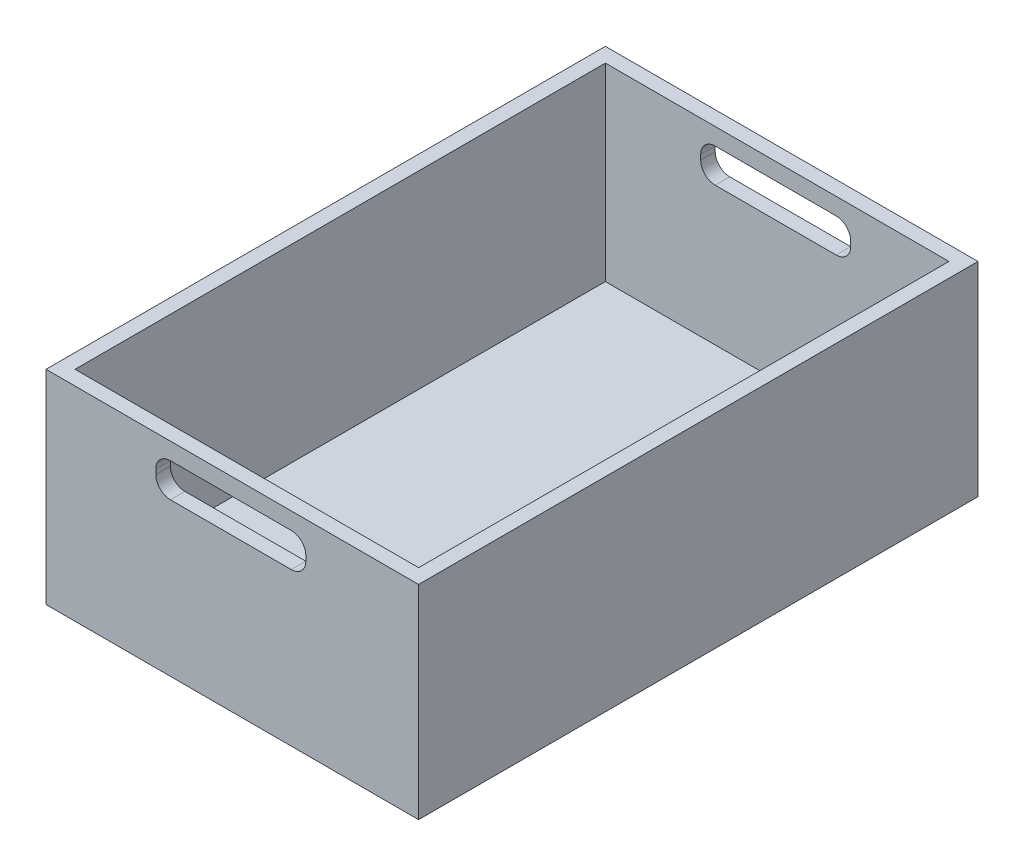
ISO-10303-21;
HEADER;
FILE_DESCRIPTION(('STEP AP214'),'2;1');
FILE_NAME('part.step','',(''),(''),'','','');
FILE_SCHEMA(('AUTOMOTIVE_DESIGN { 1 0 10303 214 1 1 1 1 }'));
ENDSEC;
DATA;
#1=APPLICATION_CONTEXT('core data for automotive mechanical design processes');
#2=APPLICATION_PROTOCOL_DEFINITION('international standard','automotive_design',2000,#1);
#3=PRODUCT_CONTEXT('',#1,'mechanical');
#4=PRODUCT('Part','Part','',(#3));
#5=PRODUCT_RELATED_PRODUCT_CATEGORY('part','',(#4));
#6=PRODUCT_DEFINITION_FORMATION('','',#4);
#7=PRODUCT_DEFINITION_CONTEXT('part definition',#1,'design');
#8=PRODUCT_DEFINITION('design','',#6,#7);
#9=PRODUCT_DEFINITION_SHAPE('','',#8);
#10=(LENGTH_UNIT() NAMED_UNIT(*) SI_UNIT(.MILLI.,.METRE.));
#11=(NAMED_UNIT(*) PLANE_ANGLE_UNIT() SI_UNIT($,.RADIAN.));
#12=(NAMED_UNIT(*) SI_UNIT($,.STERADIAN.) SOLID_ANGLE_UNIT());
#13=UNCERTAINTY_MEASURE_WITH_UNIT(LENGTH_MEASURE(1.E-05),#10,'distance_accuracy_value','');
#14=(GEOMETRIC_REPRESENTATION_CONTEXT(3) GLOBAL_UNCERTAINTY_ASSIGNED_CONTEXT((#13)) GLOBAL_UNIT_ASSIGNED_CONTEXT((#10,
#11,#12)) REPRESENTATION_CONTEXT('',''));
#15=CARTESIAN_POINT('',(0.,0.,0.));
#16=DIRECTION('',(0.,0.,1.));
#17=DIRECTION('',(1.,0.,0.));
#18=AXIS2_PLACEMENT_3D('',#15,#16,#17);
#19=CARTESIAN_POINT('',(0.,15.,0.));
#20=DIRECTION('',(0.,-1.,0.));
#21=DIRECTION('',(0.,0.,-1.));
#22=AXIS2_PLACEMENT_3D('',#19,#20,#21);
#23=PLANE('',#22);
#24=DIRECTION('',(0.,0.,1.));
#25=VECTOR('',#24,1.);
#26=CARTESIAN_POINT('',(177.5,15.,289.));
#27=LINE('',#26,#25);
#28=CARTESIAN_POINT('',(177.5,15.,-274.));
#29=VERTEX_POINT('',#28);
#30=CARTESIAN_POINT('',(177.5,15.,274.));
#31=VERTEX_POINT('',#30);
#32=EDGE_CURVE('E243',#29,#31,#27,.T.);
#33=ORIENTED_EDGE('',*,*,#32,.F.);
#34=DIRECTION('',(-1.,0.,0.));
#35=VECTOR('',#34,1.);
#36=CARTESIAN_POINT('',(-177.5,15.,-274.));
#37=LINE('',#36,#35);
#38=CARTESIAN_POINT('',(-177.5,15.,-274.));
#39=VERTEX_POINT('',#38);
#40=EDGE_CURVE('E218',#29,#39,#37,.T.);
#41=ORIENTED_EDGE('',*,*,#40,.T.);
#42=DIRECTION('',(0.,0.,1.));
#43=VECTOR('',#42,1.);
#44=CARTESIAN_POINT('',(-177.5,15.,289.));
#45=LINE('',#44,#43);
#46=CARTESIAN_POINT('',(-177.5,15.,274.));
#47=VERTEX_POINT('',#46);
#48=EDGE_CURVE('E237',#39,#47,#45,.T.);
#49=ORIENTED_EDGE('',*,*,#48,.T.);
#50=DIRECTION('',(-1.,0.,0.));
#51=VECTOR('',#50,1.);
#52=CARTESIAN_POINT('',(-177.5,15.,274.));
#53=LINE('',#52,#51);
#54=EDGE_CURVE('E225',#31,#47,#53,.T.);
#55=ORIENTED_EDGE('',*,*,#54,.F.);
#56=EDGE_LOOP('',(#33,#41,#49,#55));
#57=FACE_BOUND('',#56,.T.);
#58=ADVANCED_FACE('F33',(#57),#23,.F.);
#59=CARTESIAN_POINT('',(177.5,210.5,289.));
#60=DIRECTION('',(1.,0.,0.));
#61=DIRECTION('',(0.,0.,-1.));
#62=AXIS2_PLACEMENT_3D('',#59,#60,#61);
#63=PLANE('',#62);
#64=DIRECTION('',(0.,0.,1.));
#65=VECTOR('',#64,1.);
#66=CARTESIAN_POINT('',(177.5,210.5,289.));
#67=LINE('',#66,#65);
#68=CARTESIAN_POINT('',(177.5,210.5,-274.));
#69=VERTEX_POINT('',#68);
#70=CARTESIAN_POINT('',(177.5,210.5,274.));
#71=VERTEX_POINT('',#70);
#72=EDGE_CURVE('E250',#69,#71,#67,.T.);
#73=ORIENTED_EDGE('',*,*,#72,.F.);
#74=DIRECTION('',(0.,-1.,0.));
#75=VECTOR('',#74,1.);
#76=CARTESIAN_POINT('',(177.5,210.5,-274.));
#77=LINE('',#76,#75);
#78=EDGE_CURVE('E217',#69,#29,#77,.T.);
#79=ORIENTED_EDGE('',*,*,#78,.T.);
#80=ORIENTED_EDGE('',*,*,#32,.T.);
#81=DIRECTION('',(0.,-1.,0.));
#82=VECTOR('',#81,1.);
#83=CARTESIAN_POINT('',(177.5,210.5,274.));
#84=LINE('',#83,#82);
#85=EDGE_CURVE('E234',#71,#31,#84,.T.);
#86=ORIENTED_EDGE('',*,*,#85,.F.);
#87=EDGE_LOOP('',(#73,#79,#80,#86));
#88=FACE_BOUND('',#87,.T.);
#89=ADVANCED_FACE('F436',(#88),#63,.F.);
#90=CARTESIAN_POINT('',(-177.5,210.5,289.));
#91=DIRECTION('',(1.,0.,0.));
#92=DIRECTION('',(0.,0.,-1.));
#93=AXIS2_PLACEMENT_3D('',#90,#91,#92);
#94=PLANE('',#93);
#95=DIRECTION('',(0.,-1.,0.));
#96=VECTOR('',#95,1.);
#97=CARTESIAN_POINT('',(-177.5,210.5,-274.));
#98=LINE('',#97,#96);
#99=CARTESIAN_POINT('',(-177.5,210.5,-274.));
#100=VERTEX_POINT('',#99);
#101=EDGE_CURVE('E223',#100,#39,#98,.T.);
#102=ORIENTED_EDGE('',*,*,#101,.F.);
#103=DIRECTION('',(0.,0.,1.));
#104=VECTOR('',#103,1.);
#105=CARTESIAN_POINT('',(-177.5,210.5,289.));
#106=LINE('',#105,#104);
#107=CARTESIAN_POINT('',(-177.5,210.5,274.));
#108=VERTEX_POINT('',#107);
#109=EDGE_CURVE('E241',#100,#108,#106,.T.);
#110=ORIENTED_EDGE('',*,*,#109,.T.);
#111=DIRECTION('',(0.,-1.,0.));
#112=VECTOR('',#111,1.);
#113=CARTESIAN_POINT('',(-177.5,210.5,274.));
#114=LINE('',#113,#112);
#115=EDGE_CURVE('E229',#108,#47,#114,.T.);
#116=ORIENTED_EDGE('',*,*,#115,.T.);
#117=ORIENTED_EDGE('',*,*,#48,.F.);
#118=EDGE_LOOP('',(#102,#110,#116,#117));
#119=FACE_BOUND('',#118,.T.);
#120=ADVANCED_FACE('F442',(#119),#94,.T.);
#121=CARTESIAN_POINT('',(192.5,15.,289.));
#122=DIRECTION('',(-1.,0.,0.));
#123=DIRECTION('',(0.,0.,1.));
#124=AXIS2_PLACEMENT_3D('',#121,#122,#123);
#125=PLANE('',#124);
#126=DIRECTION('',(0.,0.,-1.));
#127=VECTOR('',#126,1.);
#128=CARTESIAN_POINT('',(192.5,0.,289.));
#129=LINE('',#128,#127);
#130=CARTESIAN_POINT('',(192.5,0.,289.));
#131=VERTEX_POINT('',#130);
#132=CARTESIAN_POINT('',(192.5,0.,-289.));
#133=VERTEX_POINT('',#132);
#134=EDGE_CURVE('E255',#131,#133,#129,.T.);
#135=ORIENTED_EDGE('',*,*,#134,.T.);
#136=DIRECTION('',(0.,-1.,0.));
#137=VECTOR('',#136,1.);
#138=CARTESIAN_POINT('',(192.5,15.,-289.));
#139=LINE('',#138,#137);
#140=CARTESIAN_POINT('',(192.5,210.5,-289.));
#141=VERTEX_POINT('',#140);
#142=EDGE_CURVE('E274',#141,#133,#139,.T.);
#143=ORIENTED_EDGE('',*,*,#142,.F.);
#144=DIRECTION('',(0.,0.,-1.));
#145=VECTOR('',#144,1.);
#146=CARTESIAN_POINT('',(192.5,210.5,289.));
#147=LINE('',#146,#145);
#148=CARTESIAN_POINT('',(192.5,210.5,289.));
#149=VERTEX_POINT('',#148);
#150=EDGE_CURVE('E245',#149,#141,#147,.T.);
#151=ORIENTED_EDGE('',*,*,#150,.F.);
#152=DIRECTION('',(0.,-1.,0.));
#153=VECTOR('',#152,1.);
#154=CARTESIAN_POINT('',(192.5,15.,289.));
#155=LINE('',#154,#153);
#156=EDGE_CURVE('E265',#149,#131,#155,.T.);
#157=ORIENTED_EDGE('',*,*,#156,.T.);
#158=EDGE_LOOP('',(#135,#143,#151,#157));
#159=FACE_BOUND('',#158,.T.);
#160=ADVANCED_FACE('F35',(#159),#125,.F.);
#161=CARTESIAN_POINT('',(-192.5,15.,-289.));
#162=DIRECTION('',(0.,0.,1.));
#163=DIRECTION('',(1.,0.,0.));
#164=AXIS2_PLACEMENT_3D('',#161,#162,#163);
#165=PLANE('',#164);
#166=DIRECTION('',(0.,1.,0.));
#167=VECTOR('',#166,1.);
#168=CARTESIAN_POINT('',(75.9655531314844,178.,-289.));
#169=LINE('',#168,#167);
#170=CARTESIAN_POINT('',(75.9655531314844,173.,-289.));
#171=VERTEX_POINT('',#170);
#172=CARTESIAN_POINT('',(75.9655531314844,178.,-289.));
#173=VERTEX_POINT('',#172);
#174=EDGE_CURVE('E386',#171,#173,#169,.T.);
#175=ORIENTED_EDGE('',*,*,#174,.T.);
#176=CARTESIAN_POINT('',(60.9655531314844,178.,-289.));
#177=DIRECTION('',(0.,0.,1.));
#178=DIRECTION('',(-1.,0.,0.));
#179=AXIS2_PLACEMENT_3D('',#176,#177,#178);
#180=CIRCLE('',#179,15.);
#181=CARTESIAN_POINT('',(60.9655531314844,193.,-289.));
#182=VERTEX_POINT('',#181);
#183=EDGE_CURVE('E392',#173,#182,#180,.T.);
#184=ORIENTED_EDGE('',*,*,#183,.T.);
#185=DIRECTION('',(-1.,0.,0.));
#186=VECTOR('',#185,1.);
#187=CARTESIAN_POINT('',(-64.0344468685156,193.,-289.));
#188=LINE('',#187,#186);
#189=CARTESIAN_POINT('',(-64.0344468685156,193.,-289.));
#190=VERTEX_POINT('',#189);
#191=EDGE_CURVE('E379',#182,#190,#188,.T.);
#192=ORIENTED_EDGE('',*,*,#191,.T.);
#193=CARTESIAN_POINT('',(-64.0344468685156,178.,-289.));
#194=DIRECTION('',(0.,0.,1.));
#195=DIRECTION('',(1.,0.,0.));
#196=AXIS2_PLACEMENT_3D('',#193,#194,#195);
#197=CIRCLE('',#196,15.);
#198=CARTESIAN_POINT('',(-79.0344468685156,178.,-289.));
#199=VERTEX_POINT('',#198);
#200=EDGE_CURVE('E51',#190,#199,#197,.T.);
#201=ORIENTED_EDGE('',*,*,#200,.T.);
#202=DIRECTION('',(0.,-1.,0.));
#203=VECTOR('',#202,1.);
#204=CARTESIAN_POINT('',(-79.0344468685156,178.,-289.));
#205=LINE('',#204,#203);
#206=CARTESIAN_POINT('',(-79.0344468685156,173.,-289.));
#207=VERTEX_POINT('',#206);
#208=EDGE_CURVE('E373',#199,#207,#205,.T.);
#209=ORIENTED_EDGE('',*,*,#208,.T.);
#210=CARTESIAN_POINT('',(-64.0344468685156,173.,-289.));
#211=DIRECTION('',(0.,0.,1.));
#212=DIRECTION('',(1.,0.,0.));
#213=AXIS2_PLACEMENT_3D('',#210,#211,#212);
#214=CIRCLE('',#213,15.);
#215=CARTESIAN_POINT('',(-64.0344468685156,158.,-289.));
#216=VERTEX_POINT('',#215);
#217=EDGE_CURVE('E364',#207,#216,#214,.T.);
#218=ORIENTED_EDGE('',*,*,#217,.T.);
#219=DIRECTION('',(1.,0.,0.));
#220=VECTOR('',#219,1.);
#221=CARTESIAN_POINT('',(-64.0344468685156,158.,-289.));
#222=LINE('',#221,#220);
#223=CARTESIAN_POINT('',(60.9655531314844,158.,-289.));
#224=VERTEX_POINT('',#223);
#225=EDGE_CURVE('E372',#216,#224,#222,.T.);
#226=ORIENTED_EDGE('',*,*,#225,.T.);
#227=CARTESIAN_POINT('',(60.9655531314844,173.,-289.));
#228=DIRECTION('',(0.,0.,1.));
#229=DIRECTION('',(1.,0.,0.));
#230=AXIS2_PLACEMENT_3D('',#227,#228,#229);
#231=CIRCLE('',#230,15.);
#232=EDGE_CURVE('E384',#224,#171,#231,.T.);
#233=ORIENTED_EDGE('',*,*,#232,.T.);
#234=EDGE_LOOP('',(#175,#184,#192,#201,#209,#218,#226,#233));
#235=FACE_BOUND('',#234,.T.);
#236=DIRECTION('',(-1.,0.,0.));
#237=VECTOR('',#236,1.);
#238=CARTESIAN_POINT('',(-192.5,0.,-289.));
#239=LINE('',#238,#237);
#240=CARTESIAN_POINT('',(-192.5,0.,-289.));
#241=VERTEX_POINT('',#240);
#242=EDGE_CURVE('E259',#133,#241,#239,.T.);
#243=ORIENTED_EDGE('',*,*,#242,.T.);
#244=DIRECTION('',(0.,-1.,0.));
#245=VECTOR('',#244,1.);
#246=CARTESIAN_POINT('',(-192.5,15.,-289.));
#247=LINE('',#246,#245);
#248=CARTESIAN_POINT('',(-192.5,210.5,-289.));
#249=VERTEX_POINT('',#248);
#250=EDGE_CURVE('E271',#249,#241,#247,.T.);
#251=ORIENTED_EDGE('',*,*,#250,.F.);
#252=DIRECTION('',(-1.,0.,0.));
#253=VECTOR('',#252,1.);
#254=CARTESIAN_POINT('',(192.5,210.5,-289.));
#255=LINE('',#254,#253);
#256=EDGE_CURVE('E248',#141,#249,#255,.T.);
#257=ORIENTED_EDGE('',*,*,#256,.F.);
#258=ORIENTED_EDGE('',*,*,#142,.T.);
#259=EDGE_LOOP('',(#243,#251,#257,#258));
#260=FACE_BOUND('',#259,.T.);
#261=ADVANCED_FACE('F376',(#235,#260),#165,.F.);
#262=CARTESIAN_POINT('',(-192.5,15.,289.));
#263=DIRECTION('',(1.,0.,0.));
#264=DIRECTION('',(0.,0.,-1.));
#265=AXIS2_PLACEMENT_3D('',#262,#263,#264);
#266=PLANE('',#265);
#267=DIRECTION('',(0.,0.,1.));
#268=VECTOR('',#267,1.);
#269=CARTESIAN_POINT('',(-192.5,0.,289.));
#270=LINE('',#269,#268);
#271=CARTESIAN_POINT('',(-192.5,0.,289.));
#272=VERTEX_POINT('',#271);
#273=EDGE_CURVE('E261',#241,#272,#270,.T.);
#274=ORIENTED_EDGE('',*,*,#273,.T.);
#275=DIRECTION('',(0.,-1.,0.));
#276=VECTOR('',#275,1.);
#277=CARTESIAN_POINT('',(-192.5,15.,289.));
#278=LINE('',#277,#276);
#279=CARTESIAN_POINT('',(-192.5,210.5,289.));
#280=VERTEX_POINT('',#279);
#281=EDGE_CURVE('E268',#280,#272,#278,.T.);
#282=ORIENTED_EDGE('',*,*,#281,.F.);
#283=DIRECTION('',(0.,0.,-1.));
#284=VECTOR('',#283,1.);
#285=CARTESIAN_POINT('',(-192.5,210.5,289.));
#286=LINE('',#285,#284);
#287=EDGE_CURVE('E238',#280,#249,#286,.T.);
#288=ORIENTED_EDGE('',*,*,#287,.T.);
#289=ORIENTED_EDGE('',*,*,#250,.T.);
#290=EDGE_LOOP('',(#274,#282,#288,#289));
#291=FACE_BOUND('',#290,.T.);
#292=ADVANCED_FACE('F455',(#291),#266,.F.);
#293=CARTESIAN_POINT('',(-192.5,15.,289.));
#294=DIRECTION('',(0.,0.,-1.));
#295=DIRECTION('',(-1.,0.,0.));
#296=AXIS2_PLACEMENT_3D('',#293,#294,#295);
#297=PLANE('',#296);
#298=DIRECTION('',(-1.,0.,0.));
#299=VECTOR('',#298,1.);
#300=CARTESIAN_POINT('',(-64.0344468685156,193.,289.));
#301=LINE('',#300,#299);
#302=CARTESIAN_POINT('',(60.9655531314844,193.,289.));
#303=VERTEX_POINT('',#302);
#304=CARTESIAN_POINT('',(-64.0344468685156,193.,289.));
#305=VERTEX_POINT('',#304);
#306=EDGE_CURVE('E171',#303,#305,#301,.T.);
#307=ORIENTED_EDGE('',*,*,#306,.F.);
#308=CARTESIAN_POINT('',(60.9655531314844,178.,289.));
#309=DIRECTION('',(0.,0.,1.));
#310=DIRECTION('',(1.,0.,0.));
#311=AXIS2_PLACEMENT_3D('',#308,#309,#310);
#312=CIRCLE('',#311,15.);
#313=CARTESIAN_POINT('',(75.9655531314844,178.,289.));
#314=VERTEX_POINT('',#313);
#315=EDGE_CURVE('E37',#314,#303,#312,.T.);
#316=ORIENTED_EDGE('',*,*,#315,.F.);
#317=DIRECTION('',(0.,1.,0.));
#318=VECTOR('',#317,1.);
#319=CARTESIAN_POINT('',(75.9655531314844,178.,289.));
#320=LINE('',#319,#318);
#321=CARTESIAN_POINT('',(75.9655531314844,173.,289.));
#322=VERTEX_POINT('',#321);
#323=EDGE_CURVE('E95',#322,#314,#320,.T.);
#324=ORIENTED_EDGE('',*,*,#323,.F.);
#325=CARTESIAN_POINT('',(60.9655531314844,173.,289.));
#326=DIRECTION('',(0.,0.,1.));
#327=DIRECTION('',(1.,0.,0.));
#328=AXIS2_PLACEMENT_3D('',#325,#326,#327);
#329=CIRCLE('',#328,15.);
#330=CARTESIAN_POINT('',(60.9655531314844,158.,289.));
#331=VERTEX_POINT('',#330);
#332=EDGE_CURVE('E211',#331,#322,#329,.T.);
#333=ORIENTED_EDGE('',*,*,#332,.F.);
#334=DIRECTION('',(1.,0.,0.));
#335=VECTOR('',#334,1.);
#336=CARTESIAN_POINT('',(-64.0344468685156,158.,289.));
#337=LINE('',#336,#335);
#338=CARTESIAN_POINT('',(-64.0344468685156,158.,289.));
#339=VERTEX_POINT('',#338);
#340=EDGE_CURVE('E207',#339,#331,#337,.T.);
#341=ORIENTED_EDGE('',*,*,#340,.F.);
#342=CARTESIAN_POINT('',(-64.0344468685156,173.,289.));
#343=DIRECTION('',(0.,0.,1.));
#344=DIRECTION('',(1.,0.,0.));
#345=AXIS2_PLACEMENT_3D('',#342,#343,#344);
#346=CIRCLE('',#345,15.);
#347=CARTESIAN_POINT('',(-79.0344468685156,173.,289.));
#348=VERTEX_POINT('',#347);
#349=EDGE_CURVE('E203',#348,#339,#346,.T.);
#350=ORIENTED_EDGE('',*,*,#349,.F.);
#351=DIRECTION('',(0.,1.,0.));
#352=VECTOR('',#351,1.);
#353=CARTESIAN_POINT('',(-79.0344468685156,178.,289.));
#354=LINE('',#353,#352);
#355=CARTESIAN_POINT('',(-79.0344468685156,178.,289.));
#356=VERTEX_POINT('',#355);
#357=EDGE_CURVE('E199',#356,#348,#354,.F.);
#358=ORIENTED_EDGE('',*,*,#357,.F.);
#359=CARTESIAN_POINT('',(-64.0344468685156,178.,289.));
#360=DIRECTION('',(0.,0.,1.));
#361=DIRECTION('',(1.,0.,0.));
#362=AXIS2_PLACEMENT_3D('',#359,#360,#361);
#363=CIRCLE('',#362,15.);
#364=EDGE_CURVE('E184',#305,#356,#363,.T.);
#365=ORIENTED_EDGE('',*,*,#364,.F.);
#366=EDGE_LOOP('',(#307,#316,#324,#333,#341,#350,#358,#365));
#367=FACE_BOUND('',#366,.T.);
#368=DIRECTION('',(1.,0.,0.));
#369=VECTOR('',#368,1.);
#370=CARTESIAN_POINT('',(-192.5,0.,289.));
#371=LINE('',#370,#369);
#372=EDGE_CURVE('E263',#272,#131,#371,.T.);
#373=ORIENTED_EDGE('',*,*,#372,.T.);
#374=ORIENTED_EDGE('',*,*,#156,.F.);
#375=DIRECTION('',(1.,0.,0.));
#376=VECTOR('',#375,1.);
#377=CARTESIAN_POINT('',(192.5,210.5,289.));
#378=LINE('',#377,#376);
#379=EDGE_CURVE('E252',#280,#149,#378,.T.);
#380=ORIENTED_EDGE('',*,*,#379,.F.);
#381=ORIENTED_EDGE('',*,*,#281,.T.);
#382=EDGE_LOOP('',(#373,#374,#380,#381));
#383=FACE_BOUND('',#382,.T.);
#384=ADVANCED_FACE('F316',(#367,#383),#297,.F.);
#385=CARTESIAN_POINT('',(0.,0.,0.));
#386=DIRECTION('',(0.,-1.,0.));
#387=DIRECTION('',(0.,0.,-1.));
#388=AXIS2_PLACEMENT_3D('',#385,#386,#387);
#389=PLANE('',#388);
#390=ORIENTED_EDGE('',*,*,#134,.F.);
#391=ORIENTED_EDGE('',*,*,#372,.F.);
#392=ORIENTED_EDGE('',*,*,#273,.F.);
#393=ORIENTED_EDGE('',*,*,#242,.F.);
#394=EDGE_LOOP('',(#390,#391,#392,#393));
#395=FACE_BOUND('',#394,.T.);
#396=ADVANCED_FACE('F448',(#395),#389,.T.);
#397=CARTESIAN_POINT('',(0.,210.5,0.));
#398=DIRECTION('',(0.,1.,0.));
#399=DIRECTION('',(0.,0.,1.));
#400=AXIS2_PLACEMENT_3D('',#397,#398,#399);
#401=PLANE('',#400);
#402=ORIENTED_EDGE('',*,*,#109,.F.);
#403=DIRECTION('',(-1.,0.,0.));
#404=VECTOR('',#403,1.);
#405=CARTESIAN_POINT('',(-177.5,210.5,-274.));
#406=LINE('',#405,#404);
#407=EDGE_CURVE('E215',#69,#100,#406,.T.);
#408=ORIENTED_EDGE('',*,*,#407,.F.);
#409=ORIENTED_EDGE('',*,*,#72,.T.);
#410=DIRECTION('',(-1.,0.,0.));
#411=VECTOR('',#410,1.);
#412=CARTESIAN_POINT('',(-177.5,210.5,274.));
#413=LINE('',#412,#411);
#414=EDGE_CURVE('E226',#71,#108,#413,.T.);
#415=ORIENTED_EDGE('',*,*,#414,.T.);
#416=EDGE_LOOP('',(#402,#408,#409,#415));
#417=FACE_BOUND('',#416,.T.);
#418=ORIENTED_EDGE('',*,*,#150,.T.);
#419=ORIENTED_EDGE('',*,*,#256,.T.);
#420=ORIENTED_EDGE('',*,*,#287,.F.);
#421=ORIENTED_EDGE('',*,*,#379,.T.);
#422=EDGE_LOOP('',(#418,#419,#420,#421));
#423=FACE_BOUND('',#422,.T.);
#424=ADVANCED_FACE('F451',(#417,#423),#401,.T.);
#425=CARTESIAN_POINT('',(-177.5,210.5,274.));
#426=DIRECTION('',(0.,0.,1.));
#427=DIRECTION('',(1.,0.,0.));
#428=AXIS2_PLACEMENT_3D('',#425,#426,#427);
#429=PLANE('',#428);
#430=DIRECTION('',(0.,1.,0.));
#431=VECTOR('',#430,1.);
#432=CARTESIAN_POINT('',(75.9655531314843,210.500000000001,274.));
#433=LINE('',#432,#431);
#434=CARTESIAN_POINT('',(75.9655531314844,173.,274.));
#435=VERTEX_POINT('',#434);
#436=CARTESIAN_POINT('',(75.9655531314844,178.,274.));
#437=VERTEX_POINT('',#436);
#438=EDGE_CURVE('E212',#435,#437,#433,.T.);
#439=ORIENTED_EDGE('',*,*,#438,.T.);
#440=CARTESIAN_POINT('',(60.9655531314844,178.,274.));
#441=DIRECTION('',(0.,0.,1.));
#442=DIRECTION('',(1.,0.,0.));
#443=AXIS2_PLACEMENT_3D('',#440,#441,#442);
#444=CIRCLE('',#443,15.);
#445=CARTESIAN_POINT('',(60.9655531314844,193.,274.));
#446=VERTEX_POINT('',#445);
#447=EDGE_CURVE('E105',#437,#446,#444,.T.);
#448=ORIENTED_EDGE('',*,*,#447,.T.);
#449=DIRECTION('',(-1.,0.,0.));
#450=VECTOR('',#449,1.);
#451=CARTESIAN_POINT('',(-177.5,193.,274.));
#452=LINE('',#451,#450);
#453=CARTESIAN_POINT('',(-64.0344468685156,193.,274.));
#454=VERTEX_POINT('',#453);
#455=EDGE_CURVE('E169',#446,#454,#452,.T.);
#456=ORIENTED_EDGE('',*,*,#455,.T.);
#457=CARTESIAN_POINT('',(-64.0344468685156,178.,274.));
#458=DIRECTION('',(0.,0.,1.));
#459=DIRECTION('',(1.,0.,0.));
#460=AXIS2_PLACEMENT_3D('',#457,#458,#459);
#461=CIRCLE('',#460,15.);
#462=CARTESIAN_POINT('',(-79.0344468685156,178.,274.));
#463=VERTEX_POINT('',#462);
#464=EDGE_CURVE('E178',#454,#463,#461,.T.);
#465=ORIENTED_EDGE('',*,*,#464,.T.);
#466=DIRECTION('',(0.,-1.,0.));
#467=VECTOR('',#466,1.);
#468=CARTESIAN_POINT('',(-79.0344468685156,210.5,274.));
#469=LINE('',#468,#467);
#470=CARTESIAN_POINT('',(-79.0344468685156,173.,274.));
#471=VERTEX_POINT('',#470);
#472=EDGE_CURVE('E197',#463,#471,#469,.T.);
#473=ORIENTED_EDGE('',*,*,#472,.T.);
#474=CARTESIAN_POINT('',(-64.0344468685156,173.,274.));
#475=DIRECTION('',(0.,0.,1.));
#476=DIRECTION('',(1.,0.,0.));
#477=AXIS2_PLACEMENT_3D('',#474,#475,#476);
#478=CIRCLE('',#477,15.);
#479=CARTESIAN_POINT('',(-64.0344468685156,158.,274.));
#480=VERTEX_POINT('',#479);
#481=EDGE_CURVE('E200',#471,#480,#478,.T.);
#482=ORIENTED_EDGE('',*,*,#481,.T.);
#483=DIRECTION('',(1.,0.,0.));
#484=VECTOR('',#483,1.);
#485=CARTESIAN_POINT('',(-177.5,158.,274.));
#486=LINE('',#485,#484);
#487=CARTESIAN_POINT('',(60.9655531314844,158.,274.));
#488=VERTEX_POINT('',#487);
#489=EDGE_CURVE('E204',#480,#488,#486,.T.);
#490=ORIENTED_EDGE('',*,*,#489,.T.);
#491=CARTESIAN_POINT('',(60.9655531314844,173.,274.));
#492=DIRECTION('',(0.,0.,1.));
#493=DIRECTION('',(1.,0.,0.));
#494=AXIS2_PLACEMENT_3D('',#491,#492,#493);
#495=CIRCLE('',#494,15.);
#496=EDGE_CURVE('E208',#488,#435,#495,.T.);
#497=ORIENTED_EDGE('',*,*,#496,.T.);
#498=EDGE_LOOP('',(#439,#448,#456,#465,#473,#482,#490,#497));
#499=FACE_BOUND('',#498,.T.);
#500=ORIENTED_EDGE('',*,*,#54,.T.);
#501=ORIENTED_EDGE('',*,*,#115,.F.);
#502=ORIENTED_EDGE('',*,*,#414,.F.);
#503=ORIENTED_EDGE('',*,*,#85,.T.);
#504=EDGE_LOOP('',(#500,#501,#502,#503));
#505=FACE_BOUND('',#504,.T.);
#506=ADVANCED_FACE('F187',(#499,#505),#429,.F.);
#507=CARTESIAN_POINT('',(-177.5,210.5,-274.));
#508=DIRECTION('',(0.,0.,1.));
#509=DIRECTION('',(1.,0.,0.));
#510=AXIS2_PLACEMENT_3D('',#507,#508,#509);
#511=PLANE('',#510);
#512=CARTESIAN_POINT('',(60.9655531314844,178.,-274.));
#513=DIRECTION('',(0.,0.,1.));
#514=DIRECTION('',(1.,0.,0.));
#515=AXIS2_PLACEMENT_3D('',#512,#513,#514);
#516=CIRCLE('',#515,15.);
#517=CARTESIAN_POINT('',(75.9655531314844,178.,-274.));
#518=VERTEX_POINT('',#517);
#519=CARTESIAN_POINT('',(60.9655531314844,193.,-274.));
#520=VERTEX_POINT('',#519);
#521=EDGE_CURVE('E11',#518,#520,#516,.T.);
#522=ORIENTED_EDGE('',*,*,#521,.F.);
#523=DIRECTION('',(0.,1.,0.));
#524=VECTOR('',#523,1.);
#525=CARTESIAN_POINT('',(75.9655531314843,210.500000000001,-274.));
#526=LINE('',#525,#524);
#527=CARTESIAN_POINT('',(75.9655531314844,173.,-274.));
#528=VERTEX_POINT('',#527);
#529=EDGE_CURVE('E43',#528,#518,#526,.T.);
#530=ORIENTED_EDGE('',*,*,#529,.F.);
#531=CARTESIAN_POINT('',(60.9655531314844,173.,-274.));
#532=DIRECTION('',(0.,0.,1.));
#533=DIRECTION('',(1.,0.,0.));
#534=AXIS2_PLACEMENT_3D('',#531,#532,#533);
#535=CIRCLE('',#534,15.);
#536=CARTESIAN_POINT('',(60.9655531314844,158.,-274.));
#537=VERTEX_POINT('',#536);
#538=EDGE_CURVE('E291',#537,#528,#535,.T.);
#539=ORIENTED_EDGE('',*,*,#538,.F.);
#540=DIRECTION('',(1.,0.,0.));
#541=VECTOR('',#540,1.);
#542=CARTESIAN_POINT('',(-177.5,158.,-274.));
#543=LINE('',#542,#541);
#544=CARTESIAN_POINT('',(-64.0344468685156,158.,-274.));
#545=VERTEX_POINT('',#544);
#546=EDGE_CURVE('E288',#545,#537,#543,.T.);
#547=ORIENTED_EDGE('',*,*,#546,.F.);
#548=CARTESIAN_POINT('',(-64.0344468685156,173.,-274.));
#549=DIRECTION('',(0.,0.,1.));
#550=DIRECTION('',(1.,0.,0.));
#551=AXIS2_PLACEMENT_3D('',#548,#549,#550);
#552=CIRCLE('',#551,15.);
#553=CARTESIAN_POINT('',(-79.0344468685156,173.,-274.));
#554=VERTEX_POINT('',#553);
#555=EDGE_CURVE('E285',#554,#545,#552,.T.);
#556=ORIENTED_EDGE('',*,*,#555,.F.);
#557=DIRECTION('',(0.,-1.,0.));
#558=VECTOR('',#557,1.);
#559=CARTESIAN_POINT('',(-79.0344468685156,210.5,-274.));
#560=LINE('',#559,#558);
#561=CARTESIAN_POINT('',(-79.0344468685156,178.,-274.));
#562=VERTEX_POINT('',#561);
#563=EDGE_CURVE('E282',#562,#554,#560,.T.);
#564=ORIENTED_EDGE('',*,*,#563,.F.);
#565=CARTESIAN_POINT('',(-64.0344468685156,178.,-274.));
#566=DIRECTION('',(0.,0.,1.));
#567=DIRECTION('',(1.,0.,0.));
#568=AXIS2_PLACEMENT_3D('',#565,#566,#567);
#569=CIRCLE('',#568,15.);
#570=CARTESIAN_POINT('',(-64.0344468685156,193.,-274.));
#571=VERTEX_POINT('',#570);
#572=EDGE_CURVE('E279',#571,#562,#569,.T.);
#573=ORIENTED_EDGE('',*,*,#572,.F.);
#574=DIRECTION('',(-1.,0.,0.));
#575=VECTOR('',#574,1.);
#576=CARTESIAN_POINT('',(-177.5,193.,-274.));
#577=LINE('',#576,#575);
#578=EDGE_CURVE('E277',#520,#571,#577,.T.);
#579=ORIENTED_EDGE('',*,*,#578,.F.);
#580=EDGE_LOOP('',(#522,#530,#539,#547,#556,#564,#573,#579));
#581=FACE_BOUND('',#580,.T.);
#582=ORIENTED_EDGE('',*,*,#40,.F.);
#583=ORIENTED_EDGE('',*,*,#78,.F.);
#584=ORIENTED_EDGE('',*,*,#407,.T.);
#585=ORIENTED_EDGE('',*,*,#101,.T.);
#586=EDGE_LOOP('',(#582,#583,#584,#585));
#587=FACE_BOUND('',#586,.T.);
#588=ADVANCED_FACE('F350',(#581,#587),#511,.T.);
#589=CARTESIAN_POINT('',(-64.0344468685156,193.,-289.));
#590=DIRECTION('',(0.,1.,0.));
#591=DIRECTION('',(-1.,0.,0.));
#592=AXIS2_PLACEMENT_3D('',#589,#590,#591);
#593=PLANE('',#592);
#594=ORIENTED_EDGE('',*,*,#578,.T.);
#595=DIRECTION('',(0.,0.,1.));
#596=VECTOR('',#595,1.);
#597=CARTESIAN_POINT('',(-64.0344468685156,193.,-289.));
#598=LINE('',#597,#596);
#599=EDGE_CURVE('E174',#190,#571,#598,.T.);
#600=ORIENTED_EDGE('',*,*,#599,.F.);
#601=ORIENTED_EDGE('',*,*,#191,.F.);
#602=DIRECTION('',(0.,0.,1.));
#603=VECTOR('',#602,1.);
#604=CARTESIAN_POINT('',(60.9655531314844,193.,-289.));
#605=LINE('',#604,#603);
#606=EDGE_CURVE('E159',#182,#520,#605,.T.);
#607=ORIENTED_EDGE('',*,*,#606,.T.);
#608=EDGE_LOOP('',(#594,#600,#601,#607));
#609=FACE_BOUND('',#608,.T.);
#610=ADVANCED_FACE('F422',(#609),#593,.F.);
#611=CARTESIAN_POINT('',(-64.0344468685156,178.,-289.));
#612=DIRECTION('',(0.,0.,1.));
#613=DIRECTION('',(1.,0.,0.));
#614=AXIS2_PLACEMENT_3D('',#611,#612,#613);
#615=CYLINDRICAL_SURFACE('',#614,15.);
#616=ORIENTED_EDGE('',*,*,#572,.T.);
#617=DIRECTION('',(0.,0.,1.));
#618=VECTOR('',#617,1.);
#619=CARTESIAN_POINT('',(-79.0344468685156,178.,-289.));
#620=LINE('',#619,#618);
#621=EDGE_CURVE('E334',#199,#562,#620,.T.);
#622=ORIENTED_EDGE('',*,*,#621,.F.);
#623=ORIENTED_EDGE('',*,*,#200,.F.);
#624=ORIENTED_EDGE('',*,*,#599,.T.);
#625=EDGE_LOOP('',(#616,#622,#623,#624));
#626=FACE_BOUND('',#625,.T.);
#627=ADVANCED_FACE('F344',(#626),#615,.F.);
#628=CARTESIAN_POINT('',(-79.0344468685156,178.,-289.));
#629=DIRECTION('',(-1.,0.,0.));
#630=DIRECTION('',(0.,0.,1.));
#631=AXIS2_PLACEMENT_3D('',#628,#629,#630);
#632=PLANE('',#631);
#633=ORIENTED_EDGE('',*,*,#563,.T.);
#634=DIRECTION('',(0.,0.,1.));
#635=VECTOR('',#634,1.);
#636=CARTESIAN_POINT('',(-79.0344468685156,173.,-289.));
#637=LINE('',#636,#635);
#638=EDGE_CURVE('E331',#207,#554,#637,.T.);
#639=ORIENTED_EDGE('',*,*,#638,.F.);
#640=ORIENTED_EDGE('',*,*,#208,.F.);
#641=ORIENTED_EDGE('',*,*,#621,.T.);
#642=EDGE_LOOP('',(#633,#639,#640,#641));
#643=FACE_BOUND('',#642,.T.);
#644=ADVANCED_FACE('F356',(#643),#632,.F.);
#645=CARTESIAN_POINT('',(-64.0344468685156,173.,-289.));
#646=DIRECTION('',(0.,0.,1.));
#647=DIRECTION('',(1.,0.,0.));
#648=AXIS2_PLACEMENT_3D('',#645,#646,#647);
#649=CYLINDRICAL_SURFACE('',#648,15.);
#650=ORIENTED_EDGE('',*,*,#555,.T.);
#651=DIRECTION('',(0.,0.,1.));
#652=VECTOR('',#651,1.);
#653=CARTESIAN_POINT('',(-64.0344468685156,158.,-289.));
#654=LINE('',#653,#652);
#655=EDGE_CURVE('E327',#216,#545,#654,.T.);
#656=ORIENTED_EDGE('',*,*,#655,.F.);
#657=ORIENTED_EDGE('',*,*,#217,.F.);
#658=ORIENTED_EDGE('',*,*,#638,.T.);
#659=EDGE_LOOP('',(#650,#656,#657,#658));
#660=FACE_BOUND('',#659,.T.);
#661=ADVANCED_FACE('F361',(#660),#649,.F.);
#662=CARTESIAN_POINT('',(-64.0344468685156,158.,-289.));
#663=DIRECTION('',(0.,-1.,0.));
#664=DIRECTION('',(0.,0.,-1.));
#665=AXIS2_PLACEMENT_3D('',#662,#663,#664);
#666=PLANE('',#665);
#667=ORIENTED_EDGE('',*,*,#546,.T.);
#668=DIRECTION('',(0.,0.,1.));
#669=VECTOR('',#668,1.);
#670=CARTESIAN_POINT('',(60.9655531314844,158.,-289.));
#671=LINE('',#670,#669);
#672=EDGE_CURVE('E313',#224,#537,#671,.T.);
#673=ORIENTED_EDGE('',*,*,#672,.F.);
#674=ORIENTED_EDGE('',*,*,#225,.F.);
#675=ORIENTED_EDGE('',*,*,#655,.T.);
#676=EDGE_LOOP('',(#667,#673,#674,#675));
#677=FACE_BOUND('',#676,.T.);
#678=ADVANCED_FACE('F493',(#677),#666,.F.);
#679=CARTESIAN_POINT('',(60.9655531314844,173.,-289.));
#680=DIRECTION('',(0.,0.,1.));
#681=DIRECTION('',(1.,0.,0.));
#682=AXIS2_PLACEMENT_3D('',#679,#680,#681);
#683=CYLINDRICAL_SURFACE('',#682,15.);
#684=ORIENTED_EDGE('',*,*,#538,.T.);
#685=DIRECTION('',(0.,0.,1.));
#686=VECTOR('',#685,1.);
#687=CARTESIAN_POINT('',(75.9655531314844,173.,-289.));
#688=LINE('',#687,#686);
#689=EDGE_CURVE('E312',#171,#528,#688,.T.);
#690=ORIENTED_EDGE('',*,*,#689,.F.);
#691=ORIENTED_EDGE('',*,*,#232,.F.);
#692=ORIENTED_EDGE('',*,*,#672,.T.);
#693=EDGE_LOOP('',(#684,#690,#691,#692));
#694=FACE_BOUND('',#693,.T.);
#695=ADVANCED_FACE('F418',(#694),#683,.F.);
#696=CARTESIAN_POINT('',(75.9655531314844,178.,-289.));
#697=DIRECTION('',(1.,0.,0.));
#698=DIRECTION('',(0.,1.,0.));
#699=AXIS2_PLACEMENT_3D('',#696,#697,#698);
#700=PLANE('',#699);
#701=ORIENTED_EDGE('',*,*,#529,.T.);
#702=DIRECTION('',(0.,0.,1.));
#703=VECTOR('',#702,1.);
#704=CARTESIAN_POINT('',(75.9655531314844,178.,-289.));
#705=LINE('',#704,#703);
#706=EDGE_CURVE('E189',#173,#518,#705,.T.);
#707=ORIENTED_EDGE('',*,*,#706,.F.);
#708=ORIENTED_EDGE('',*,*,#174,.F.);
#709=ORIENTED_EDGE('',*,*,#689,.T.);
#710=EDGE_LOOP('',(#701,#707,#708,#709));
#711=FACE_BOUND('',#710,.T.);
#712=ADVANCED_FACE('F398',(#711),#700,.F.);
#713=CARTESIAN_POINT('',(60.9655531314844,178.,-289.));
#714=DIRECTION('',(0.,0.,1.));
#715=DIRECTION('',(1.,0.,0.));
#716=AXIS2_PLACEMENT_3D('',#713,#714,#715);
#717=CYLINDRICAL_SURFACE('',#716,15.);
#718=ORIENTED_EDGE('',*,*,#521,.T.);
#719=ORIENTED_EDGE('',*,*,#606,.F.);
#720=ORIENTED_EDGE('',*,*,#183,.F.);
#721=ORIENTED_EDGE('',*,*,#706,.T.);
#722=EDGE_LOOP('',(#718,#719,#720,#721));
#723=FACE_BOUND('',#722,.T.);
#724=ADVANCED_FACE('F420',(#723),#717,.F.);
#725=EDGE_CURVE('E320',#446,#303,#605,.T.);
#726=ORIENTED_EDGE('',*,*,#725,.F.);
#727=ORIENTED_EDGE('',*,*,#447,.F.);
#728=EDGE_CURVE('E193',#437,#314,#705,.T.);
#729=ORIENTED_EDGE('',*,*,#728,.T.);
#730=ORIENTED_EDGE('',*,*,#315,.T.);
#731=EDGE_LOOP('',(#726,#727,#729,#730));
#732=FACE_BOUND('',#731,.T.);
#733=ADVANCED_FACE('F319',(#732),#717,.F.);
#734=ORIENTED_EDGE('',*,*,#728,.F.);
#735=ORIENTED_EDGE('',*,*,#438,.F.);
#736=EDGE_CURVE('E305',#435,#322,#688,.T.);
#737=ORIENTED_EDGE('',*,*,#736,.T.);
#738=ORIENTED_EDGE('',*,*,#323,.T.);
#739=EDGE_LOOP('',(#734,#735,#737,#738));
#740=FACE_BOUND('',#739,.T.);
#741=ADVANCED_FACE('F311',(#740),#700,.F.);
#742=ORIENTED_EDGE('',*,*,#736,.F.);
#743=ORIENTED_EDGE('',*,*,#496,.F.);
#744=EDGE_CURVE('E307',#488,#331,#671,.T.);
#745=ORIENTED_EDGE('',*,*,#744,.T.);
#746=ORIENTED_EDGE('',*,*,#332,.T.);
#747=EDGE_LOOP('',(#742,#743,#745,#746));
#748=FACE_BOUND('',#747,.T.);
#749=ADVANCED_FACE('F303',(#748),#683,.F.);
#750=ORIENTED_EDGE('',*,*,#744,.F.);
#751=ORIENTED_EDGE('',*,*,#489,.F.);
#752=EDGE_CURVE('E330',#480,#339,#654,.T.);
#753=ORIENTED_EDGE('',*,*,#752,.T.);
#754=ORIENTED_EDGE('',*,*,#340,.T.);
#755=EDGE_LOOP('',(#750,#751,#753,#754));
#756=FACE_BOUND('',#755,.T.);
#757=ADVANCED_FACE('F499',(#756),#666,.F.);
#758=ORIENTED_EDGE('',*,*,#752,.F.);
#759=ORIENTED_EDGE('',*,*,#481,.F.);
#760=EDGE_CURVE('E333',#471,#348,#637,.T.);
#761=ORIENTED_EDGE('',*,*,#760,.T.);
#762=ORIENTED_EDGE('',*,*,#349,.T.);
#763=EDGE_LOOP('',(#758,#759,#761,#762));
#764=FACE_BOUND('',#763,.T.);
#765=ADVANCED_FACE('F503',(#764),#649,.F.);
#766=ORIENTED_EDGE('',*,*,#760,.F.);
#767=ORIENTED_EDGE('',*,*,#472,.F.);
#768=EDGE_CURVE('E181',#463,#356,#620,.T.);
#769=ORIENTED_EDGE('',*,*,#768,.T.);
#770=ORIENTED_EDGE('',*,*,#357,.T.);
#771=EDGE_LOOP('',(#766,#767,#769,#770));
#772=FACE_BOUND('',#771,.T.);
#773=ADVANCED_FACE('F512',(#772),#632,.F.);
#774=ORIENTED_EDGE('',*,*,#768,.F.);
#775=ORIENTED_EDGE('',*,*,#464,.F.);
#776=EDGE_CURVE('E164',#454,#305,#598,.T.);
#777=ORIENTED_EDGE('',*,*,#776,.T.);
#778=ORIENTED_EDGE('',*,*,#364,.T.);
#779=EDGE_LOOP('',(#774,#775,#777,#778));
#780=FACE_BOUND('',#779,.T.);
#781=ADVANCED_FACE('F179',(#780),#615,.F.);
#782=ORIENTED_EDGE('',*,*,#776,.F.);
#783=ORIENTED_EDGE('',*,*,#455,.F.);
#784=ORIENTED_EDGE('',*,*,#725,.T.);
#785=ORIENTED_EDGE('',*,*,#306,.T.);
#786=EDGE_LOOP('',(#782,#783,#784,#785));
#787=FACE_BOUND('',#786,.T.);
#788=ADVANCED_FACE('F166',(#787),#593,.F.);
#789=CLOSED_SHELL('',(#58,#89,#120,#160,#261,#292,#384,#396,#424,#506,#588,#610,#627,#644,#661,
#678,#695,#712,#724,#733,#741,#749,#757,#765,#773,#781,#788));
#790=MANIFOLD_SOLID_BREP('B2',#789);
#791=ADVANCED_BREP_SHAPE_REPRESENTATION('',(#18,#790),#14);
#792=SHAPE_DEFINITION_REPRESENTATION(#9,#791);
ENDSEC;
END-ISO-10303-21;
